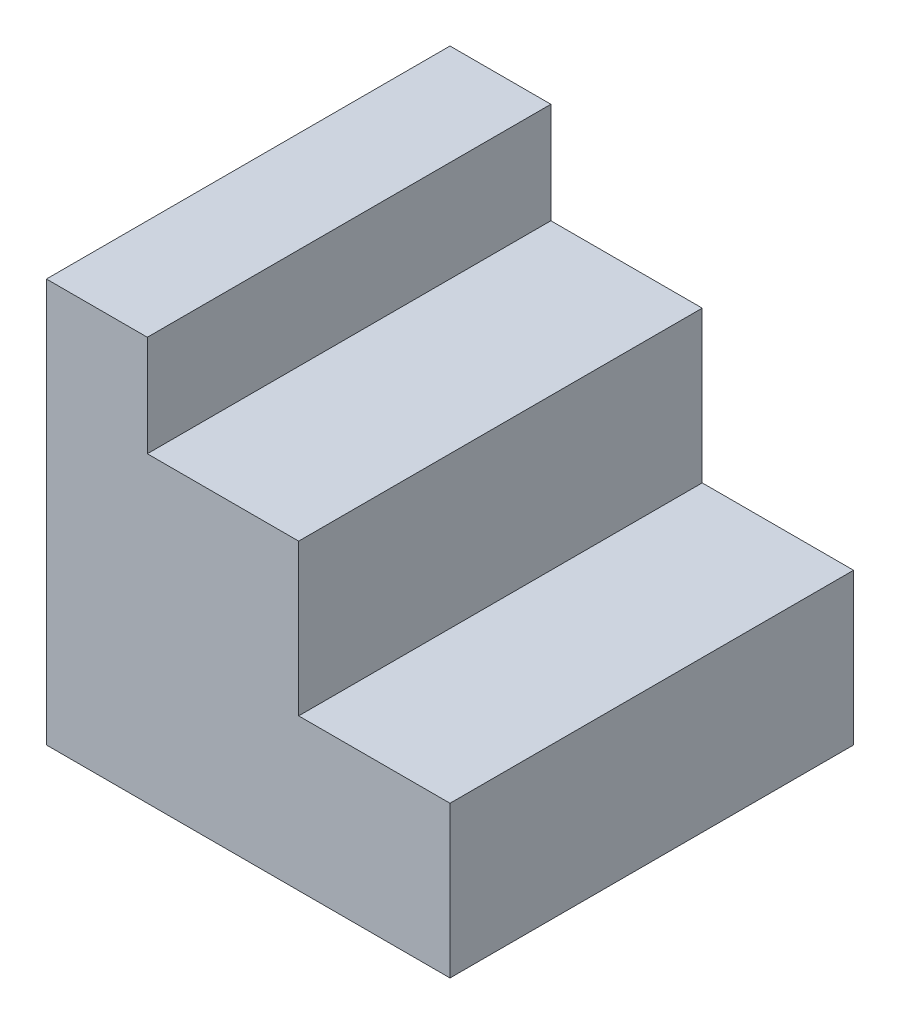
ISO-10303-21;
HEADER;
FILE_DESCRIPTION(('STEP AP214'),'2;1');
FILE_NAME('part.step','',(''),(''),'','','');
FILE_SCHEMA(('AUTOMOTIVE_DESIGN { 1 0 10303 214 1 1 1 1 }'));
ENDSEC;
DATA;
#1=APPLICATION_CONTEXT('core data for automotive mechanical design processes');
#2=APPLICATION_PROTOCOL_DEFINITION('international standard','automotive_design',2000,#1);
#3=PRODUCT_CONTEXT('',#1,'mechanical');
#4=PRODUCT('Part','Part','',(#3));
#5=PRODUCT_RELATED_PRODUCT_CATEGORY('part','',(#4));
#6=PRODUCT_DEFINITION_FORMATION('','',#4);
#7=PRODUCT_DEFINITION_CONTEXT('part definition',#1,'design');
#8=PRODUCT_DEFINITION('design','',#6,#7);
#9=PRODUCT_DEFINITION_SHAPE('','',#8);
#10=(LENGTH_UNIT() NAMED_UNIT(*) SI_UNIT(.MILLI.,.METRE.));
#11=(NAMED_UNIT(*) PLANE_ANGLE_UNIT() SI_UNIT($,.RADIAN.));
#12=(NAMED_UNIT(*) SI_UNIT($,.STERADIAN.) SOLID_ANGLE_UNIT());
#13=UNCERTAINTY_MEASURE_WITH_UNIT(LENGTH_MEASURE(1.E-05),#10,'distance_accuracy_value','');
#14=(GEOMETRIC_REPRESENTATION_CONTEXT(3) GLOBAL_UNCERTAINTY_ASSIGNED_CONTEXT((#13)) GLOBAL_UNIT_ASSIGNED_CONTEXT((#10,
#11,#12)) REPRESENTATION_CONTEXT('',''));
#15=CARTESIAN_POINT('',(0.,0.,0.));
#16=DIRECTION('',(0.,0.,1.));
#17=DIRECTION('',(1.,0.,0.));
#18=AXIS2_PLACEMENT_3D('',#15,#16,#17);
#19=CARTESIAN_POINT('',(20.,-7.5,40.));
#20=DIRECTION('',(-1.,0.,0.));
#21=DIRECTION('',(0.,0.,1.));
#22=AXIS2_PLACEMENT_3D('',#19,#20,#21);
#23=PLANE('',#22);
#24=DIRECTION('',(0.,1.,0.));
#25=VECTOR('',#24,1.);
#26=CARTESIAN_POINT('',(20.,-7.5,0.));
#27=LINE('',#26,#25);
#28=CARTESIAN_POINT('',(20.,-7.5,0.));
#29=VERTEX_POINT('',#28);
#30=CARTESIAN_POINT('',(20.,7.5,0.));
#31=VERTEX_POINT('',#30);
#32=EDGE_CURVE('E129',#29,#31,#27,.T.);
#33=ORIENTED_EDGE('',*,*,#32,.T.);
#34=DIRECTION('',(0.,0.,-1.));
#35=VECTOR('',#34,1.);
#36=CARTESIAN_POINT('',(20.,7.5,40.));
#37=LINE('',#36,#35);
#38=CARTESIAN_POINT('',(20.,7.5,40.));
#39=VERTEX_POINT('',#38);
#40=EDGE_CURVE('E11',#39,#31,#37,.T.);
#41=ORIENTED_EDGE('',*,*,#40,.F.);
#42=DIRECTION('',(0.,1.,0.));
#43=VECTOR('',#42,1.);
#44=CARTESIAN_POINT('',(20.,-7.5,40.));
#45=LINE('',#44,#43);
#46=CARTESIAN_POINT('',(20.,-7.5,40.));
#47=VERTEX_POINT('',#46);
#48=EDGE_CURVE('E143',#47,#39,#45,.T.);
#49=ORIENTED_EDGE('',*,*,#48,.F.);
#50=DIRECTION('',(0.,0.,-1.));
#51=VECTOR('',#50,1.);
#52=CARTESIAN_POINT('',(20.,-7.5,40.));
#53=LINE('',#52,#51);
#54=EDGE_CURVE('E125',#47,#29,#53,.T.);
#55=ORIENTED_EDGE('',*,*,#54,.T.);
#56=EDGE_LOOP('',(#33,#41,#49,#55));
#57=FACE_BOUND('',#56,.T.);
#58=ADVANCED_FACE('F33',(#57),#23,.F.);
#59=CARTESIAN_POINT('',(5.,7.5,40.));
#60=DIRECTION('',(0.,-1.,0.));
#61=DIRECTION('',(0.,0.,-1.));
#62=AXIS2_PLACEMENT_3D('',#59,#60,#61);
#63=PLANE('',#62);
#64=DIRECTION('',(-1.,0.,0.));
#65=VECTOR('',#64,1.);
#66=CARTESIAN_POINT('',(5.,7.5,0.));
#67=LINE('',#66,#65);
#68=CARTESIAN_POINT('',(5.,7.5,0.));
#69=VERTEX_POINT('',#68);
#70=EDGE_CURVE('E132',#31,#69,#67,.T.);
#71=ORIENTED_EDGE('',*,*,#70,.T.);
#72=DIRECTION('',(0.,0.,-1.));
#73=VECTOR('',#72,1.);
#74=CARTESIAN_POINT('',(5.,7.5,40.));
#75=LINE('',#74,#73);
#76=CARTESIAN_POINT('',(5.,7.5,40.));
#77=VERTEX_POINT('',#76);
#78=EDGE_CURVE('E41',#77,#69,#75,.T.);
#79=ORIENTED_EDGE('',*,*,#78,.F.);
#80=DIRECTION('',(-1.,0.,0.));
#81=VECTOR('',#80,1.);
#82=CARTESIAN_POINT('',(5.,7.5,40.));
#83=LINE('',#82,#81);
#84=EDGE_CURVE('E91',#39,#77,#83,.T.);
#85=ORIENTED_EDGE('',*,*,#84,.F.);
#86=ORIENTED_EDGE('',*,*,#40,.T.);
#87=EDGE_LOOP('',(#71,#79,#85,#86));
#88=FACE_BOUND('',#87,.T.);
#89=ADVANCED_FACE('F178',(#88),#63,.F.);
#90=CARTESIAN_POINT('',(5.,7.5,40.));
#91=DIRECTION('',(-1.,0.,0.));
#92=DIRECTION('',(0.,0.,1.));
#93=AXIS2_PLACEMENT_3D('',#90,#91,#92);
#94=PLANE('',#93);
#95=DIRECTION('',(0.,1.,0.));
#96=VECTOR('',#95,1.);
#97=CARTESIAN_POINT('',(5.,7.5,0.));
#98=LINE('',#97,#96);
#99=CARTESIAN_POINT('',(5.,22.5,0.));
#100=VERTEX_POINT('',#99);
#101=EDGE_CURVE('E134',#69,#100,#98,.T.);
#102=ORIENTED_EDGE('',*,*,#101,.T.);
#103=DIRECTION('',(0.,0.,-1.));
#104=VECTOR('',#103,1.);
#105=CARTESIAN_POINT('',(5.,22.5,40.));
#106=LINE('',#105,#104);
#107=CARTESIAN_POINT('',(5.,22.5,40.));
#108=VERTEX_POINT('',#107);
#109=EDGE_CURVE('E150',#108,#100,#106,.T.);
#110=ORIENTED_EDGE('',*,*,#109,.F.);
#111=DIRECTION('',(0.,1.,0.));
#112=VECTOR('',#111,1.);
#113=CARTESIAN_POINT('',(5.,7.5,40.));
#114=LINE('',#113,#112);
#115=EDGE_CURVE('E158',#77,#108,#114,.T.);
#116=ORIENTED_EDGE('',*,*,#115,.F.);
#117=ORIENTED_EDGE('',*,*,#78,.T.);
#118=EDGE_LOOP('',(#102,#110,#116,#117));
#119=FACE_BOUND('',#118,.T.);
#120=ADVANCED_FACE('F156',(#119),#94,.F.);
#121=CARTESIAN_POINT('',(-10.,22.5,40.));
#122=DIRECTION('',(0.,-1.,0.));
#123=DIRECTION('',(0.,0.,-1.));
#124=AXIS2_PLACEMENT_3D('',#121,#122,#123);
#125=PLANE('',#124);
#126=DIRECTION('',(-1.,0.,0.));
#127=VECTOR('',#126,1.);
#128=CARTESIAN_POINT('',(-10.,22.5,0.));
#129=LINE('',#128,#127);
#130=CARTESIAN_POINT('',(-10.,22.5,0.));
#131=VERTEX_POINT('',#130);
#132=EDGE_CURVE('E136',#100,#131,#129,.T.);
#133=ORIENTED_EDGE('',*,*,#132,.T.);
#134=DIRECTION('',(0.,0.,-1.));
#135=VECTOR('',#134,1.);
#136=CARTESIAN_POINT('',(-10.,22.5,40.));
#137=LINE('',#136,#135);
#138=CARTESIAN_POINT('',(-10.,22.5,40.));
#139=VERTEX_POINT('',#138);
#140=EDGE_CURVE('E147',#139,#131,#137,.T.);
#141=ORIENTED_EDGE('',*,*,#140,.F.);
#142=DIRECTION('',(-1.,0.,0.));
#143=VECTOR('',#142,1.);
#144=CARTESIAN_POINT('',(-10.,22.5,40.));
#145=LINE('',#144,#143);
#146=EDGE_CURVE('E170',#108,#139,#145,.T.);
#147=ORIENTED_EDGE('',*,*,#146,.F.);
#148=ORIENTED_EDGE('',*,*,#109,.T.);
#149=EDGE_LOOP('',(#133,#141,#147,#148));
#150=FACE_BOUND('',#149,.T.);
#151=ADVANCED_FACE('F166',(#150),#125,.F.);
#152=CARTESIAN_POINT('',(-10.,22.5,40.));
#153=DIRECTION('',(-1.,0.,0.));
#154=DIRECTION('',(0.,0.,1.));
#155=AXIS2_PLACEMENT_3D('',#152,#153,#154);
#156=PLANE('',#155);
#157=DIRECTION('',(0.,1.,0.));
#158=VECTOR('',#157,1.);
#159=CARTESIAN_POINT('',(-10.,22.5,0.));
#160=LINE('',#159,#158);
#161=CARTESIAN_POINT('',(-10.,32.5,0.));
#162=VERTEX_POINT('',#161);
#163=EDGE_CURVE('E138',#131,#162,#160,.T.);
#164=ORIENTED_EDGE('',*,*,#163,.T.);
#165=DIRECTION('',(0.,0.,-1.));
#166=VECTOR('',#165,1.);
#167=CARTESIAN_POINT('',(-10.,32.5,40.));
#168=LINE('',#167,#166);
#169=CARTESIAN_POINT('',(-10.,32.5,40.));
#170=VERTEX_POINT('',#169);
#171=EDGE_CURVE('E120',#170,#162,#168,.T.);
#172=ORIENTED_EDGE('',*,*,#171,.F.);
#173=DIRECTION('',(0.,1.,0.));
#174=VECTOR('',#173,1.);
#175=CARTESIAN_POINT('',(-10.,22.5,40.));
#176=LINE('',#175,#174);
#177=EDGE_CURVE('E110',#139,#170,#176,.T.);
#178=ORIENTED_EDGE('',*,*,#177,.F.);
#179=ORIENTED_EDGE('',*,*,#140,.T.);
#180=EDGE_LOOP('',(#164,#172,#178,#179));
#181=FACE_BOUND('',#180,.T.);
#182=ADVANCED_FACE('F169',(#181),#156,.F.);
#183=CARTESIAN_POINT('',(-20.,32.5,40.));
#184=DIRECTION('',(0.,-1.,0.));
#185=DIRECTION('',(0.,0.,-1.));
#186=AXIS2_PLACEMENT_3D('',#183,#184,#185);
#187=PLANE('',#186);
#188=DIRECTION('',(-1.,0.,0.));
#189=VECTOR('',#188,1.);
#190=CARTESIAN_POINT('',(-20.,32.5,0.));
#191=LINE('',#190,#189);
#192=CARTESIAN_POINT('',(-20.,32.5,0.));
#193=VERTEX_POINT('',#192);
#194=EDGE_CURVE('E119',#162,#193,#191,.T.);
#195=ORIENTED_EDGE('',*,*,#194,.T.);
#196=DIRECTION('',(0.,0.,-1.));
#197=VECTOR('',#196,1.);
#198=CARTESIAN_POINT('',(-20.,32.5,40.));
#199=LINE('',#198,#197);
#200=CARTESIAN_POINT('',(-20.,32.5,40.));
#201=VERTEX_POINT('',#200);
#202=EDGE_CURVE('E116',#201,#193,#199,.T.);
#203=ORIENTED_EDGE('',*,*,#202,.F.);
#204=DIRECTION('',(-1.,0.,0.));
#205=VECTOR('',#204,1.);
#206=CARTESIAN_POINT('',(-20.,32.5,40.));
#207=LINE('',#206,#205);
#208=EDGE_CURVE('E104',#170,#201,#207,.T.);
#209=ORIENTED_EDGE('',*,*,#208,.F.);
#210=ORIENTED_EDGE('',*,*,#171,.T.);
#211=EDGE_LOOP('',(#195,#203,#209,#210));
#212=FACE_BOUND('',#211,.T.);
#213=ADVANCED_FACE('F117',(#212),#187,.F.);
#214=CARTESIAN_POINT('',(-20.,-7.5,40.));
#215=DIRECTION('',(1.,0.,0.));
#216=DIRECTION('',(0.,0.,-1.));
#217=AXIS2_PLACEMENT_3D('',#214,#215,#216);
#218=PLANE('',#217);
#219=DIRECTION('',(0.,-1.,0.));
#220=VECTOR('',#219,1.);
#221=CARTESIAN_POINT('',(-20.,-7.5,0.));
#222=LINE('',#221,#220);
#223=CARTESIAN_POINT('',(-20.,-7.5,0.));
#224=VERTEX_POINT('',#223);
#225=EDGE_CURVE('E77',#193,#224,#222,.T.);
#226=ORIENTED_EDGE('',*,*,#225,.T.);
#227=DIRECTION('',(0.,0.,-1.));
#228=VECTOR('',#227,1.);
#229=CARTESIAN_POINT('',(-20.,-7.5,40.));
#230=LINE('',#229,#228);
#231=CARTESIAN_POINT('',(-20.,-7.5,40.));
#232=VERTEX_POINT('',#231);
#233=EDGE_CURVE('E121',#232,#224,#230,.T.);
#234=ORIENTED_EDGE('',*,*,#233,.F.);
#235=DIRECTION('',(0.,-1.,0.));
#236=VECTOR('',#235,1.);
#237=CARTESIAN_POINT('',(-20.,22.5,40.));
#238=LINE('',#237,#236);
#239=EDGE_CURVE('E108',#201,#232,#238,.T.);
#240=ORIENTED_EDGE('',*,*,#239,.F.);
#241=ORIENTED_EDGE('',*,*,#202,.T.);
#242=EDGE_LOOP('',(#226,#234,#240,#241));
#243=FACE_BOUND('',#242,.T.);
#244=ADVANCED_FACE('F123',(#243),#218,.F.);
#245=CARTESIAN_POINT('',(-20.,-7.5,40.));
#246=DIRECTION('',(0.,1.,0.));
#247=DIRECTION('',(0.,0.,1.));
#248=AXIS2_PLACEMENT_3D('',#245,#246,#247);
#249=PLANE('',#248);
#250=DIRECTION('',(1.,0.,0.));
#251=VECTOR('',#250,1.);
#252=CARTESIAN_POINT('',(-20.,-7.5,0.));
#253=LINE('',#252,#251);
#254=EDGE_CURVE('E83',#224,#29,#253,.T.);
#255=ORIENTED_EDGE('',*,*,#254,.T.);
#256=ORIENTED_EDGE('',*,*,#54,.F.);
#257=DIRECTION('',(1.,0.,0.));
#258=VECTOR('',#257,1.);
#259=CARTESIAN_POINT('',(-20.,-7.5,40.));
#260=LINE('',#259,#258);
#261=EDGE_CURVE('E49',#232,#47,#260,.T.);
#262=ORIENTED_EDGE('',*,*,#261,.F.);
#263=ORIENTED_EDGE('',*,*,#233,.T.);
#264=EDGE_LOOP('',(#255,#256,#262,#263));
#265=FACE_BOUND('',#264,.T.);
#266=ADVANCED_FACE('F194',(#265),#249,.F.);
#267=CARTESIAN_POINT('',(0.,0.,40.));
#268=DIRECTION('',(0.,0.,-1.));
#269=DIRECTION('',(-1.,0.,0.));
#270=AXIS2_PLACEMENT_3D('',#267,#268,#269);
#271=PLANE('',#270);
#272=ORIENTED_EDGE('',*,*,#48,.T.);
#273=ORIENTED_EDGE('',*,*,#84,.T.);
#274=ORIENTED_EDGE('',*,*,#115,.T.);
#275=ORIENTED_EDGE('',*,*,#146,.T.);
#276=ORIENTED_EDGE('',*,*,#177,.T.);
#277=ORIENTED_EDGE('',*,*,#208,.T.);
#278=ORIENTED_EDGE('',*,*,#239,.T.);
#279=ORIENTED_EDGE('',*,*,#261,.T.);
#280=EDGE_LOOP('',(#272,#273,#274,#275,#276,#277,#278,#279));
#281=FACE_BOUND('',#280,.T.);
#282=ADVANCED_FACE('F106',(#281),#271,.F.);
#283=CARTESIAN_POINT('',(0.,0.,0.));
#284=DIRECTION('',(0.,0.,-1.));
#285=DIRECTION('',(-1.,0.,0.));
#286=AXIS2_PLACEMENT_3D('',#283,#284,#285);
#287=PLANE('',#286);
#288=ORIENTED_EDGE('',*,*,#32,.F.);
#289=ORIENTED_EDGE('',*,*,#254,.F.);
#290=ORIENTED_EDGE('',*,*,#225,.F.);
#291=ORIENTED_EDGE('',*,*,#194,.F.);
#292=ORIENTED_EDGE('',*,*,#163,.F.);
#293=ORIENTED_EDGE('',*,*,#132,.F.);
#294=ORIENTED_EDGE('',*,*,#101,.F.);
#295=ORIENTED_EDGE('',*,*,#70,.F.);
#296=EDGE_LOOP('',(#288,#289,#290,#291,#292,#293,#294,#295));
#297=FACE_BOUND('',#296,.T.);
#298=ADVANCED_FACE('F162',(#297),#287,.T.);
#299=CLOSED_SHELL('',(#58,#89,#120,#151,#182,#213,#244,#266,#282,#298));
#300=MANIFOLD_SOLID_BREP('B2',#299);
#301=ADVANCED_BREP_SHAPE_REPRESENTATION('',(#18,#300),#14);
#302=SHAPE_DEFINITION_REPRESENTATION(#9,#301);
ENDSEC;
END-ISO-10303-21;
